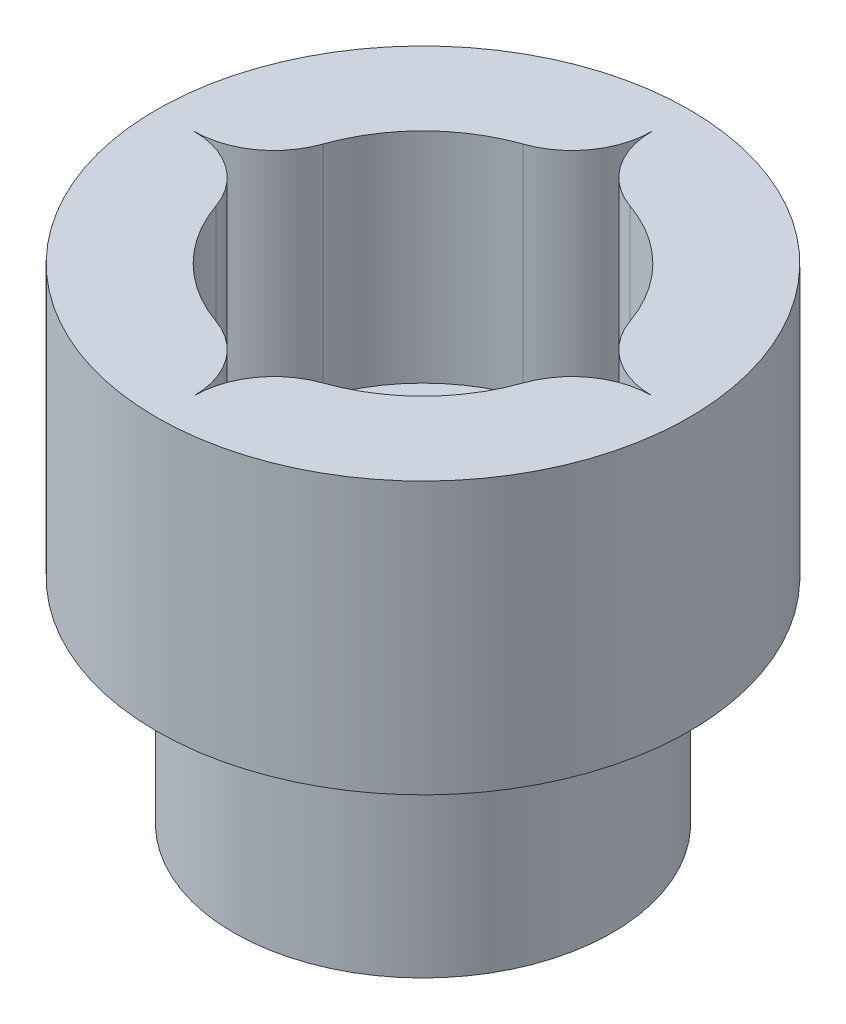
ISO-10303-21;
HEADER;
FILE_DESCRIPTION(('STEP AP214'),'2;1');
FILE_NAME('part.step','',(''),(''),'','','');
FILE_SCHEMA(('AUTOMOTIVE_DESIGN { 1 0 10303 214 1 1 1 1 }'));
ENDSEC;
DATA;
#1=APPLICATION_CONTEXT('core data for automotive mechanical design processes');
#2=APPLICATION_PROTOCOL_DEFINITION('international standard','automotive_design',2000,#1);
#3=PRODUCT_CONTEXT('',#1,'mechanical');
#4=PRODUCT('Part','Part','',(#3));
#5=PRODUCT_RELATED_PRODUCT_CATEGORY('part','',(#4));
#6=PRODUCT_DEFINITION_FORMATION('','',#4);
#7=PRODUCT_DEFINITION_CONTEXT('part definition',#1,'design');
#8=PRODUCT_DEFINITION('design','',#6,#7);
#9=PRODUCT_DEFINITION_SHAPE('','',#8);
#10=(LENGTH_UNIT() NAMED_UNIT(*) SI_UNIT(.MILLI.,.METRE.));
#11=(NAMED_UNIT(*) PLANE_ANGLE_UNIT() SI_UNIT($,.RADIAN.));
#12=(NAMED_UNIT(*) SI_UNIT($,.STERADIAN.) SOLID_ANGLE_UNIT());
#13=UNCERTAINTY_MEASURE_WITH_UNIT(LENGTH_MEASURE(1.E-05),#10,'distance_accuracy_value','');
#14=(GEOMETRIC_REPRESENTATION_CONTEXT(3) GLOBAL_UNCERTAINTY_ASSIGNED_CONTEXT((#13)) GLOBAL_UNIT_ASSIGNED_CONTEXT((#10,
#11,#12)) REPRESENTATION_CONTEXT('',''));
#15=CARTESIAN_POINT('',(0.,0.,0.));
#16=DIRECTION('',(0.,0.,1.));
#17=DIRECTION('',(1.,0.,0.));
#18=AXIS2_PLACEMENT_3D('',#15,#16,#17);
#19=CARTESIAN_POINT('',(0.,4.,0.));
#20=DIRECTION('',(0.,-1.,0.));
#21=DIRECTION('',(0.,0.,-1.));
#22=AXIS2_PLACEMENT_3D('',#19,#20,#21);
#23=CYLINDRICAL_SURFACE('',#22,1.65);
#24=CARTESIAN_POINT('',(0.,0.,0.));
#25=DIRECTION('',(0.,1.,0.));
#26=DIRECTION('',(0.,0.,1.));
#27=AXIS2_PLACEMENT_3D('',#24,#25,#26);
#28=CIRCLE('',#27,1.65);
#29=CARTESIAN_POINT('',(0.824999999999999,0.,1.42894191624432));
#30=VERTEX_POINT('',#29);
#31=CARTESIAN_POINT('',(1.46542854883102,0.,0.758300183483433));
#32=VERTEX_POINT('',#31);
#33=EDGE_CURVE('E398',#30,#32,#28,.T.);
#34=ORIENTED_EDGE('',*,*,#33,.F.);
#35=DIRECTION('',(0.,-1.,0.));
#36=VECTOR('',#35,1.);
#37=CARTESIAN_POINT('',(0.824999999999999,4.,1.42894191624432));
#38=LINE('',#37,#36);
#39=CARTESIAN_POINT('',(0.824999999999999,4.,1.42894191624432));
#40=VERTEX_POINT('',#39);
#41=EDGE_CURVE('E11',#40,#30,#38,.T.);
#42=ORIENTED_EDGE('',*,*,#41,.F.);
#43=CARTESIAN_POINT('',(0.,4.,0.));
#44=DIRECTION('',(0.,1.,0.));
#45=DIRECTION('',(0.,0.,1.));
#46=AXIS2_PLACEMENT_3D('',#43,#44,#45);
#47=CIRCLE('',#46,1.65);
#48=CARTESIAN_POINT('',(1.46542854883102,4.,0.758300183483433));
#49=VERTEX_POINT('',#48);
#50=EDGE_CURVE('E349',#40,#49,#47,.T.);
#51=ORIENTED_EDGE('',*,*,#50,.T.);
#52=DIRECTION('',(0.,-1.,0.));
#53=VECTOR('',#52,1.);
#54=CARTESIAN_POINT('',(1.46542854883102,4.,0.758300183483433));
#55=LINE('',#54,#53);
#56=EDGE_CURVE('E394',#49,#32,#55,.T.);
#57=ORIENTED_EDGE('',*,*,#56,.T.);
#58=EDGE_LOOP('',(#34,#42,#51,#57));
#59=FACE_BOUND('',#58,.T.);
#60=ADVANCED_FACE('F47',(#59),#23,.F.);
#61=CARTESIAN_POINT('',(1.6175,4.,2.80159218124266));
#62=DIRECTION('',(0.,-1.,0.));
#63=DIRECTION('',(0.,0.,-1.));
#64=AXIS2_PLACEMENT_3D('',#61,#62,#63);
#65=CYLINDRICAL_SURFACE('',#64,1.585);
#66=CARTESIAN_POINT('',(1.6175,0.,2.80159218124266));
#67=DIRECTION('',(0.,1.,0.));
#68=DIRECTION('',(0.,0.,1.));
#69=AXIS2_PLACEMENT_3D('',#66,#67,#68);
#70=CIRCLE('',#69,1.585);
#71=CARTESIAN_POINT('',(0.0325,0.,2.80159218124266));
#72=VERTEX_POINT('',#71);
#73=EDGE_CURVE('E402',#72,#30,#70,.F.);
#74=ORIENTED_EDGE('',*,*,#73,.F.);
#75=DIRECTION('',(0.,-1.,0.));
#76=VECTOR('',#75,1.);
#77=CARTESIAN_POINT('',(0.0325,4.,2.80159218124266));
#78=LINE('',#77,#76);
#79=CARTESIAN_POINT('',(0.0325,4.,2.80159218124266));
#80=VERTEX_POINT('',#79);
#81=EDGE_CURVE('E56',#80,#72,#78,.T.);
#82=ORIENTED_EDGE('',*,*,#81,.F.);
#83=CARTESIAN_POINT('',(1.6175,4.,2.80159218124266));
#84=DIRECTION('',(0.,1.,0.));
#85=DIRECTION('',(0.,0.,1.));
#86=AXIS2_PLACEMENT_3D('',#83,#84,#85);
#87=CIRCLE('',#86,1.585);
#88=EDGE_CURVE('E354',#80,#40,#87,.F.);
#89=ORIENTED_EDGE('',*,*,#88,.T.);
#90=ORIENTED_EDGE('',*,*,#41,.T.);
#91=EDGE_LOOP('',(#74,#82,#89,#90));
#92=FACE_BOUND('',#91,.T.);
#93=ADVANCED_FACE('F486',(#92),#65,.T.);
#94=CARTESIAN_POINT('',(-1.55209706631351,4.,2.83732924086716));
#95=DIRECTION('',(0.,-1.,0.));
#96=DIRECTION('',(0.,0.,-1.));
#97=AXIS2_PLACEMENT_3D('',#94,#95,#96);
#98=CYLINDRICAL_SURFACE('',#97,1.585);
#99=CARTESIAN_POINT('',(-1.55209706631351,0.,2.83732924086716));
#100=DIRECTION('',(0.,1.,0.));
#101=DIRECTION('',(0.,0.,1.));
#102=AXIS2_PLACEMENT_3D('',#99,#100,#101);
#103=CIRCLE('',#102,1.585);
#104=CARTESIAN_POINT('',(-0.825000000000001,0.,1.42894191624432));
#105=VERTEX_POINT('',#104);
#106=EDGE_CURVE('E406',#72,#105,#103,.T.);
#107=ORIENTED_EDGE('',*,*,#106,.T.);
#108=DIRECTION('',(0.,-1.,0.));
#109=VECTOR('',#108,1.);
#110=CARTESIAN_POINT('',(-0.825000000000001,4.,1.42894191624432));
#111=LINE('',#110,#109);
#112=CARTESIAN_POINT('',(-0.825000000000001,4.,1.42894191624432));
#113=VERTEX_POINT('',#112);
#114=EDGE_CURVE('E471',#113,#105,#111,.T.);
#115=ORIENTED_EDGE('',*,*,#114,.F.);
#116=CARTESIAN_POINT('',(-1.55209706631351,4.,2.83732924086716));
#117=DIRECTION('',(0.,1.,0.));
#118=DIRECTION('',(0.,0.,1.));
#119=AXIS2_PLACEMENT_3D('',#116,#117,#118);
#120=CIRCLE('',#119,1.585);
#121=EDGE_CURVE('E358',#80,#113,#120,.T.);
#122=ORIENTED_EDGE('',*,*,#121,.F.);
#123=ORIENTED_EDGE('',*,*,#81,.T.);
#124=EDGE_LOOP('',(#107,#115,#122,#123));
#125=FACE_BOUND('',#124,.T.);
#126=ADVANCED_FACE('F478',(#125),#98,.T.);
#127=CARTESIAN_POINT('',(0.,4.,0.));
#128=DIRECTION('',(0.,-1.,0.));
#129=DIRECTION('',(0.,0.,-1.));
#130=AXIS2_PLACEMENT_3D('',#127,#128,#129);
#131=CYLINDRICAL_SURFACE('',#130,1.65);
#132=CARTESIAN_POINT('',(0.,0.,0.));
#133=DIRECTION('',(0.,1.,0.));
#134=DIRECTION('',(0.,0.,1.));
#135=AXIS2_PLACEMENT_3D('',#132,#133,#134);
#136=CIRCLE('',#135,1.65);
#137=CARTESIAN_POINT('',(-1.42894191624432,0.,0.825));
#138=VERTEX_POINT('',#137);
#139=EDGE_CURVE('E410',#138,#105,#136,.T.);
#140=ORIENTED_EDGE('',*,*,#139,.F.);
#141=DIRECTION('',(0.,-1.,0.));
#142=VECTOR('',#141,1.);
#143=CARTESIAN_POINT('',(-1.42894191624432,4.,0.825));
#144=LINE('',#143,#142);
#145=CARTESIAN_POINT('',(-1.42894191624432,4.,0.825));
#146=VERTEX_POINT('',#145);
#147=EDGE_CURVE('E468',#146,#138,#144,.T.);
#148=ORIENTED_EDGE('',*,*,#147,.F.);
#149=CARTESIAN_POINT('',(0.,4.,0.));
#150=DIRECTION('',(0.,1.,0.));
#151=DIRECTION('',(0.,0.,1.));
#152=AXIS2_PLACEMENT_3D('',#149,#150,#151);
#153=CIRCLE('',#152,1.65);
#154=EDGE_CURVE('E361',#146,#113,#153,.T.);
#155=ORIENTED_EDGE('',*,*,#154,.T.);
#156=ORIENTED_EDGE('',*,*,#114,.T.);
#157=EDGE_LOOP('',(#140,#148,#155,#156));
#158=FACE_BOUND('',#157,.T.);
#159=ADVANCED_FACE('F526',(#158),#131,.F.);
#160=CARTESIAN_POINT('',(-2.83732924086716,4.,1.55209706631351));
#161=DIRECTION('',(0.,-1.,0.));
#162=DIRECTION('',(0.,0.,-1.));
#163=AXIS2_PLACEMENT_3D('',#160,#161,#162);
#164=CYLINDRICAL_SURFACE('',#163,1.585);
#165=CARTESIAN_POINT('',(-2.83732924086716,0.,1.55209706631351));
#166=DIRECTION('',(0.,1.,0.));
#167=DIRECTION('',(0.,0.,1.));
#168=AXIS2_PLACEMENT_3D('',#165,#166,#167);
#169=CIRCLE('',#168,1.585);
#170=CARTESIAN_POINT('',(-2.80159218124266,0.,-0.0325000000000002));
#171=VERTEX_POINT('',#170);
#172=EDGE_CURVE('E414',#138,#171,#169,.T.);
#173=ORIENTED_EDGE('',*,*,#172,.T.);
#174=DIRECTION('',(0.,-1.,0.));
#175=VECTOR('',#174,1.);
#176=CARTESIAN_POINT('',(-2.80159218124266,4.,-0.0325000000000002));
#177=LINE('',#176,#175);
#178=CARTESIAN_POINT('',(-2.80159218124266,4.,-0.0325000000000002));
#179=VERTEX_POINT('',#178);
#180=EDGE_CURVE('E465',#179,#171,#177,.T.);
#181=ORIENTED_EDGE('',*,*,#180,.F.);
#182=CARTESIAN_POINT('',(-2.83732924086716,4.,1.55209706631351));
#183=DIRECTION('',(0.,1.,0.));
#184=DIRECTION('',(0.,0.,1.));
#185=AXIS2_PLACEMENT_3D('',#182,#183,#184);
#186=CIRCLE('',#185,1.585);
#187=EDGE_CURVE('E365',#146,#179,#186,.T.);
#188=ORIENTED_EDGE('',*,*,#187,.F.);
#189=ORIENTED_EDGE('',*,*,#147,.T.);
#190=EDGE_LOOP('',(#173,#181,#188,#189));
#191=FACE_BOUND('',#190,.T.);
#192=ADVANCED_FACE('F523',(#191),#164,.T.);
#193=CARTESIAN_POINT('',(-2.80159218124266,4.,-1.6175));
#194=DIRECTION('',(0.,-1.,0.));
#195=DIRECTION('',(0.,0.,-1.));
#196=AXIS2_PLACEMENT_3D('',#193,#194,#195);
#197=CYLINDRICAL_SURFACE('',#196,1.585);
#198=CARTESIAN_POINT('',(-2.80159218124266,0.,-1.6175));
#199=DIRECTION('',(0.,1.,0.));
#200=DIRECTION('',(0.,0.,1.));
#201=AXIS2_PLACEMENT_3D('',#198,#199,#200);
#202=CIRCLE('',#201,1.585);
#203=CARTESIAN_POINT('',(-1.42894191624432,0.,-0.825));
#204=VERTEX_POINT('',#203);
#205=EDGE_CURVE('E418',#204,#171,#202,.F.);
#206=ORIENTED_EDGE('',*,*,#205,.F.);
#207=DIRECTION('',(0.,-1.,0.));
#208=VECTOR('',#207,1.);
#209=CARTESIAN_POINT('',(-1.42894191624432,4.,-0.825));
#210=LINE('',#209,#208);
#211=CARTESIAN_POINT('',(-1.42894191624432,4.,-0.825));
#212=VERTEX_POINT('',#211);
#213=EDGE_CURVE('E462',#212,#204,#210,.T.);
#214=ORIENTED_EDGE('',*,*,#213,.F.);
#215=CARTESIAN_POINT('',(-2.80159218124266,4.,-1.6175));
#216=DIRECTION('',(0.,1.,0.));
#217=DIRECTION('',(0.,0.,1.));
#218=AXIS2_PLACEMENT_3D('',#215,#216,#217);
#219=CIRCLE('',#218,1.585);
#220=EDGE_CURVE('E368',#212,#179,#219,.F.);
#221=ORIENTED_EDGE('',*,*,#220,.T.);
#222=ORIENTED_EDGE('',*,*,#180,.T.);
#223=EDGE_LOOP('',(#206,#214,#221,#222));
#224=FACE_BOUND('',#223,.T.);
#225=ADVANCED_FACE('F519',(#224),#197,.T.);
#226=CARTESIAN_POINT('',(0.,4.,0.));
#227=DIRECTION('',(0.,-1.,0.));
#228=DIRECTION('',(0.,0.,-1.));
#229=AXIS2_PLACEMENT_3D('',#226,#227,#228);
#230=CYLINDRICAL_SURFACE('',#229,1.65);
#231=CARTESIAN_POINT('',(0.,0.,0.));
#232=DIRECTION('',(0.,1.,0.));
#233=DIRECTION('',(0.,0.,1.));
#234=AXIS2_PLACEMENT_3D('',#231,#232,#233);
#235=CIRCLE('',#234,1.65);
#236=CARTESIAN_POINT('',(-0.808423493044823,0.,-1.43838501657004));
#237=VERTEX_POINT('',#236);
#238=EDGE_CURVE('E422',#237,#204,#235,.T.);
#239=ORIENTED_EDGE('',*,*,#238,.F.);
#240=DIRECTION('',(0.,-1.,0.));
#241=VECTOR('',#240,1.);
#242=CARTESIAN_POINT('',(-0.808423493044823,4.,-1.43838501657004));
#243=LINE('',#242,#241);
#244=CARTESIAN_POINT('',(-0.808423493044823,4.,-1.43838501657004));
#245=VERTEX_POINT('',#244);
#246=EDGE_CURVE('E459',#245,#237,#243,.T.);
#247=ORIENTED_EDGE('',*,*,#246,.F.);
#248=CARTESIAN_POINT('',(0.,4.,0.));
#249=DIRECTION('',(0.,1.,0.));
#250=DIRECTION('',(0.,0.,1.));
#251=AXIS2_PLACEMENT_3D('',#248,#249,#250);
#252=CIRCLE('',#251,1.65);
#253=EDGE_CURVE('E372',#245,#212,#252,.T.);
#254=ORIENTED_EDGE('',*,*,#253,.T.);
#255=ORIENTED_EDGE('',*,*,#213,.T.);
#256=EDGE_LOOP('',(#239,#247,#254,#255));
#257=FACE_BOUND('',#256,.T.);
#258=ADVANCED_FACE('F515',(#257),#230,.F.);
#259=CARTESIAN_POINT('',(-1.585,4.,-2.82010638097218));
#260=DIRECTION('',(0.,-1.,0.));
#261=DIRECTION('',(0.,0.,-1.));
#262=AXIS2_PLACEMENT_3D('',#259,#260,#261);
#263=CYLINDRICAL_SURFACE('',#262,1.585);
#264=CARTESIAN_POINT('',(-1.585,0.,-2.82010638097218));
#265=DIRECTION('',(0.,1.,0.));
#266=DIRECTION('',(0.,0.,1.));
#267=AXIS2_PLACEMENT_3D('',#264,#265,#266);
#268=CIRCLE('',#267,1.585);
#269=CARTESIAN_POINT('',(0.,0.,-2.82010638097218));
#270=VERTEX_POINT('',#269);
#271=EDGE_CURVE('E426',#270,#237,#268,.F.);
#272=ORIENTED_EDGE('',*,*,#271,.F.);
#273=DIRECTION('',(0.,-1.,0.));
#274=VECTOR('',#273,1.);
#275=CARTESIAN_POINT('',(0.,4.,-2.82010638097218));
#276=LINE('',#275,#274);
#277=CARTESIAN_POINT('',(0.,4.,-2.82010638097218));
#278=VERTEX_POINT('',#277);
#279=EDGE_CURVE('E456',#278,#270,#276,.T.);
#280=ORIENTED_EDGE('',*,*,#279,.F.);
#281=CARTESIAN_POINT('',(-1.585,4.,-2.82010638097218));
#282=DIRECTION('',(0.,1.,0.));
#283=DIRECTION('',(0.,0.,1.));
#284=AXIS2_PLACEMENT_3D('',#281,#282,#283);
#285=CIRCLE('',#284,1.585);
#286=EDGE_CURVE('E376',#278,#245,#285,.F.);
#287=ORIENTED_EDGE('',*,*,#286,.T.);
#288=ORIENTED_EDGE('',*,*,#246,.T.);
#289=EDGE_LOOP('',(#272,#280,#287,#288));
#290=FACE_BOUND('',#289,.T.);
#291=ADVANCED_FACE('F511',(#290),#263,.T.);
#292=CARTESIAN_POINT('',(1.585,4.,-2.82010638097218));
#293=DIRECTION('',(0.,-1.,0.));
#294=DIRECTION('',(0.,0.,-1.));
#295=AXIS2_PLACEMENT_3D('',#292,#293,#294);
#296=CYLINDRICAL_SURFACE('',#295,1.585);
#297=CARTESIAN_POINT('',(1.585,0.,-2.82010638097218));
#298=DIRECTION('',(0.,1.,0.));
#299=DIRECTION('',(0.,0.,1.));
#300=AXIS2_PLACEMENT_3D('',#297,#298,#299);
#301=CIRCLE('',#300,1.585);
#302=CARTESIAN_POINT('',(0.808423493044822,0.,-1.43838501657005));
#303=VERTEX_POINT('',#302);
#304=EDGE_CURVE('E430',#270,#303,#301,.T.);
#305=ORIENTED_EDGE('',*,*,#304,.T.);
#306=DIRECTION('',(0.,-1.,0.));
#307=VECTOR('',#306,1.);
#308=CARTESIAN_POINT('',(0.808423493044822,4.,-1.43838501657005));
#309=LINE('',#308,#307);
#310=CARTESIAN_POINT('',(0.808423493044822,4.,-1.43838501657005));
#311=VERTEX_POINT('',#310);
#312=EDGE_CURVE('E453',#311,#303,#309,.T.);
#313=ORIENTED_EDGE('',*,*,#312,.F.);
#314=CARTESIAN_POINT('',(1.585,4.,-2.82010638097218));
#315=DIRECTION('',(0.,1.,0.));
#316=DIRECTION('',(0.,0.,1.));
#317=AXIS2_PLACEMENT_3D('',#314,#315,#316);
#318=CIRCLE('',#317,1.585);
#319=EDGE_CURVE('E380',#278,#311,#318,.T.);
#320=ORIENTED_EDGE('',*,*,#319,.F.);
#321=ORIENTED_EDGE('',*,*,#279,.T.);
#322=EDGE_LOOP('',(#305,#313,#320,#321));
#323=FACE_BOUND('',#322,.T.);
#324=ADVANCED_FACE('F507',(#323),#296,.T.);
#325=CARTESIAN_POINT('',(0.,4.,0.));
#326=DIRECTION('',(0.,-1.,0.));
#327=DIRECTION('',(0.,0.,-1.));
#328=AXIS2_PLACEMENT_3D('',#325,#326,#327);
#329=CYLINDRICAL_SURFACE('',#328,1.65);
#330=CARTESIAN_POINT('',(0.,0.,0.));
#331=DIRECTION('',(0.,1.,0.));
#332=DIRECTION('',(0.,0.,1.));
#333=AXIS2_PLACEMENT_3D('',#330,#331,#332);
#334=CIRCLE('',#333,1.65);
#335=CARTESIAN_POINT('',(1.42894191624432,0.,-0.825));
#336=VERTEX_POINT('',#335);
#337=EDGE_CURVE('E434',#336,#303,#334,.T.);
#338=ORIENTED_EDGE('',*,*,#337,.F.);
#339=DIRECTION('',(0.,-1.,0.));
#340=VECTOR('',#339,1.);
#341=CARTESIAN_POINT('',(1.42894191624432,4.,-0.825));
#342=LINE('',#341,#340);
#343=CARTESIAN_POINT('',(1.42894191624432,4.,-0.825));
#344=VERTEX_POINT('',#343);
#345=EDGE_CURVE('E450',#344,#336,#342,.T.);
#346=ORIENTED_EDGE('',*,*,#345,.F.);
#347=CARTESIAN_POINT('',(0.,4.,0.));
#348=DIRECTION('',(0.,1.,0.));
#349=DIRECTION('',(0.,0.,1.));
#350=AXIS2_PLACEMENT_3D('',#347,#348,#349);
#351=CIRCLE('',#350,1.65);
#352=EDGE_CURVE('E383',#344,#311,#351,.T.);
#353=ORIENTED_EDGE('',*,*,#352,.T.);
#354=ORIENTED_EDGE('',*,*,#312,.T.);
#355=EDGE_LOOP('',(#338,#346,#353,#354));
#356=FACE_BOUND('',#355,.T.);
#357=ADVANCED_FACE('F503',(#356),#329,.F.);
#358=CARTESIAN_POINT('',(2.80159218124266,4.,-1.6175));
#359=DIRECTION('',(0.,-1.,0.));
#360=DIRECTION('',(0.,0.,-1.));
#361=AXIS2_PLACEMENT_3D('',#358,#359,#360);
#362=CYLINDRICAL_SURFACE('',#361,1.585);
#363=CARTESIAN_POINT('',(2.80159218124266,0.,-1.6175));
#364=DIRECTION('',(0.,1.,0.));
#365=DIRECTION('',(0.,0.,1.));
#366=AXIS2_PLACEMENT_3D('',#363,#364,#365);
#367=CIRCLE('',#366,1.585);
#368=CARTESIAN_POINT('',(2.80159218124266,0.,-0.0325000000000002));
#369=VERTEX_POINT('',#368);
#370=EDGE_CURVE('E438',#336,#369,#367,.T.);
#371=ORIENTED_EDGE('',*,*,#370,.T.);
#372=DIRECTION('',(0.,-1.,0.));
#373=VECTOR('',#372,1.);
#374=CARTESIAN_POINT('',(2.80159218124266,4.,-0.0325000000000002));
#375=LINE('',#374,#373);
#376=CARTESIAN_POINT('',(2.80159218124266,4.,-0.0325000000000002));
#377=VERTEX_POINT('',#376);
#378=EDGE_CURVE('E447',#377,#369,#375,.T.);
#379=ORIENTED_EDGE('',*,*,#378,.F.);
#380=CARTESIAN_POINT('',(2.80159218124266,4.,-1.6175));
#381=DIRECTION('',(0.,1.,0.));
#382=DIRECTION('',(0.,0.,1.));
#383=AXIS2_PLACEMENT_3D('',#380,#381,#382);
#384=CIRCLE('',#383,1.585);
#385=EDGE_CURVE('E387',#344,#377,#384,.T.);
#386=ORIENTED_EDGE('',*,*,#385,.F.);
#387=ORIENTED_EDGE('',*,*,#345,.T.);
#388=EDGE_LOOP('',(#371,#379,#386,#387));
#389=FACE_BOUND('',#388,.T.);
#390=ADVANCED_FACE('F498',(#389),#362,.T.);
#391=CARTESIAN_POINT('',(0.,4.,0.));
#392=DIRECTION('',(0.,-1.,0.));
#393=DIRECTION('',(0.,0.,-1.));
#394=AXIS2_PLACEMENT_3D('',#391,#392,#393);
#395=CYLINDRICAL_SURFACE('',#394,3.55107458235115);
#396=CARTESIAN_POINT('',(0.,4.,0.));
#397=DIRECTION('',(0.,1.,0.));
#398=DIRECTION('',(0.,0.,1.));
#399=AXIS2_PLACEMENT_3D('',#396,#397,#398);
#400=CIRCLE('',#399,3.55107458235115);
#401=CARTESIAN_POINT('',(0.,4.,3.55107458235115));
#402=VERTEX_POINT('',#401);
#403=EDGE_CURVE('E345',#402,#402,#400,.T.);
#404=ORIENTED_EDGE('',*,*,#403,.F.);
#405=EDGE_LOOP('',(#404));
#406=FACE_BOUND('',#405,.T.);
#407=CARTESIAN_POINT('',(0.,0.,0.));
#408=DIRECTION('',(0.,1.,0.));
#409=DIRECTION('',(0.,0.,1.));
#410=AXIS2_PLACEMENT_3D('',#407,#408,#409);
#411=CIRCLE('',#410,3.55107458235115);
#412=CARTESIAN_POINT('',(0.,0.,3.55107458235115));
#413=VERTEX_POINT('',#412);
#414=EDGE_CURVE('E344',#413,#413,#411,.T.);
#415=ORIENTED_EDGE('',*,*,#414,.T.);
#416=EDGE_LOOP('',(#415));
#417=FACE_BOUND('',#416,.T.);
#418=ADVANCED_FACE('F49',(#406,#417),#395,.T.);
#419=CARTESIAN_POINT('',(2.83732924086716,4.,1.55209706631351));
#420=DIRECTION('',(0.,-1.,0.));
#421=DIRECTION('',(0.,0.,-1.));
#422=AXIS2_PLACEMENT_3D('',#419,#420,#421);
#423=CYLINDRICAL_SURFACE('',#422,1.585);
#424=CARTESIAN_POINT('',(2.83732924086716,0.,1.55209706631351));
#425=DIRECTION('',(0.,1.,0.));
#426=DIRECTION('',(0.,0.,1.));
#427=AXIS2_PLACEMENT_3D('',#424,#425,#426);
#428=CIRCLE('',#427,1.585);
#429=EDGE_CURVE('E350',#32,#369,#428,.F.);
#430=ORIENTED_EDGE('',*,*,#429,.F.);
#431=ORIENTED_EDGE('',*,*,#56,.F.);
#432=CARTESIAN_POINT('',(2.83732924086716,4.,1.55209706631351));
#433=DIRECTION('',(0.,1.,0.));
#434=DIRECTION('',(0.,0.,1.));
#435=AXIS2_PLACEMENT_3D('',#432,#433,#434);
#436=CIRCLE('',#435,1.585);
#437=EDGE_CURVE('E390',#49,#377,#436,.F.);
#438=ORIENTED_EDGE('',*,*,#437,.T.);
#439=ORIENTED_EDGE('',*,*,#378,.T.);
#440=EDGE_LOOP('',(#430,#431,#438,#439));
#441=FACE_BOUND('',#440,.T.);
#442=ADVANCED_FACE('F494',(#441),#423,.T.);
#443=CARTESIAN_POINT('',(0.,0.,0.));
#444=DIRECTION('',(0.,1.,0.));
#445=DIRECTION('',(0.,0.,1.));
#446=AXIS2_PLACEMENT_3D('',#443,#444,#445);
#447=PLANE('',#446);
#448=ORIENTED_EDGE('',*,*,#414,.F.);
#449=EDGE_LOOP('',(#448));
#450=FACE_BOUND('',#449,.T.);
#451=ORIENTED_EDGE('',*,*,#33,.T.);
#452=ORIENTED_EDGE('',*,*,#429,.T.);
#453=ORIENTED_EDGE('',*,*,#370,.F.);
#454=ORIENTED_EDGE('',*,*,#337,.T.);
#455=ORIENTED_EDGE('',*,*,#304,.F.);
#456=ORIENTED_EDGE('',*,*,#271,.T.);
#457=ORIENTED_EDGE('',*,*,#238,.T.);
#458=ORIENTED_EDGE('',*,*,#205,.T.);
#459=ORIENTED_EDGE('',*,*,#172,.F.);
#460=ORIENTED_EDGE('',*,*,#139,.T.);
#461=ORIENTED_EDGE('',*,*,#106,.F.);
#462=ORIENTED_EDGE('',*,*,#73,.T.);
#463=EDGE_LOOP('',(#451,#452,#453,#454,#455,#456,#457,#458,#459,#460,#461,#462));
#464=FACE_BOUND('',#463,.T.);
#465=ADVANCED_FACE('F483',(#450,#464),#447,.F.);
#466=CARTESIAN_POINT('',(0.,4.,0.));
#467=DIRECTION('',(0.,1.,0.));
#468=DIRECTION('',(0.,0.,1.));
#469=AXIS2_PLACEMENT_3D('',#466,#467,#468);
#470=PLANE('',#469);
#471=ORIENTED_EDGE('',*,*,#50,.F.);
#472=ORIENTED_EDGE('',*,*,#88,.F.);
#473=ORIENTED_EDGE('',*,*,#121,.T.);
#474=ORIENTED_EDGE('',*,*,#154,.F.);
#475=ORIENTED_EDGE('',*,*,#187,.T.);
#476=ORIENTED_EDGE('',*,*,#220,.F.);
#477=ORIENTED_EDGE('',*,*,#253,.F.);
#478=ORIENTED_EDGE('',*,*,#286,.F.);
#479=ORIENTED_EDGE('',*,*,#319,.T.);
#480=ORIENTED_EDGE('',*,*,#352,.F.);
#481=ORIENTED_EDGE('',*,*,#385,.T.);
#482=ORIENTED_EDGE('',*,*,#437,.F.);
#483=EDGE_LOOP('',(#471,#472,#473,#474,#475,#476,#477,#478,#479,#480,#481,#482));
#484=FACE_BOUND('',#483,.T.);
#485=ADVANCED_FACE('F528',(#484),#470,.F.);
#486=CARTESIAN_POINT('',(0.,4.,0.));
#487=DIRECTION('',(0.,1.,0.));
#488=DIRECTION('',(0.,0.,1.));
#489=AXIS2_PLACEMENT_3D('',#486,#487,#488);
#490=CIRCLE('',#489,5.);
#491=CARTESIAN_POINT('',(0.,4.,5.));
#492=VERTEX_POINT('',#491);
#493=EDGE_CURVE('E340',#492,#492,#490,.T.);
#494=ORIENTED_EDGE('',*,*,#493,.F.);
#495=EDGE_LOOP('',(#494));
#496=FACE_BOUND('',#495,.T.);
#497=ORIENTED_EDGE('',*,*,#403,.T.);
#498=EDGE_LOOP('',(#497));
#499=FACE_BOUND('',#498,.T.);
#500=ADVANCED_FACE('F530',(#496,#499),#470,.F.);
#501=CARTESIAN_POINT('',(0.,5.,0.));
#502=DIRECTION('',(0.,-1.,0.));
#503=DIRECTION('',(0.,0.,-1.));
#504=AXIS2_PLACEMENT_3D('',#501,#502,#503);
#505=CYLINDRICAL_SURFACE('',#504,5.);
#506=ORIENTED_EDGE('',*,*,#493,.T.);
#507=EDGE_LOOP('',(#506));
#508=FACE_BOUND('',#507,.T.);
#509=CARTESIAN_POINT('',(0.,9.1,0.));
#510=DIRECTION('',(0.,1.,0.));
#511=DIRECTION('',(0.,0.,1.));
#512=AXIS2_PLACEMENT_3D('',#509,#510,#511);
#513=CIRCLE('',#512,5.);
#514=CARTESIAN_POINT('',(0.,9.1,5.));
#515=VERTEX_POINT('',#514);
#516=EDGE_CURVE('E224',#515,#515,#513,.T.);
#517=ORIENTED_EDGE('',*,*,#516,.F.);
#518=EDGE_LOOP('',(#517));
#519=FACE_BOUND('',#518,.T.);
#520=ADVANCED_FACE('F536',(#508,#519),#505,.T.);
#521=CARTESIAN_POINT('',(0.,9.1,0.));
#522=DIRECTION('',(0.,1.,0.));
#523=DIRECTION('',(0.,0.,1.));
#524=AXIS2_PLACEMENT_3D('',#521,#522,#523);
#525=PLANE('',#524);
#526=ORIENTED_EDGE('',*,*,#516,.T.);
#527=EDGE_LOOP('',(#526));
#528=FACE_BOUND('',#527,.T.);
#529=CARTESIAN_POINT('',(1.49621812217711,9.1,-4.29295126285873));
#530=DIRECTION('',(0.,-1.,0.));
#531=DIRECTION('',(0.,0.,1.));
#532=AXIS2_PLACEMENT_3D('',#529,#530,#531);
#533=CIRCLE('',#532,1.49621812217709);
#534=CARTESIAN_POINT('',(1.00379373580404,9.1,-2.8800864806392));
#535=VERTEX_POINT('',#534);
#536=CARTESIAN_POINT('',(0.,9.1,-4.29295126285873));
#537=VERTEX_POINT('',#536);
#538=EDGE_CURVE('E217',#535,#537,#533,.T.);
#539=ORIENTED_EDGE('',*,*,#538,.F.);
#540=CARTESIAN_POINT('',(0.,9.1,0.));
#541=DIRECTION('',(0.,1.,0.));
#542=DIRECTION('',(0.,0.,1.));
#543=AXIS2_PLACEMENT_3D('',#540,#541,#542);
#544=CIRCLE('',#543,3.05000000000009);
#545=CARTESIAN_POINT('',(2.8800864806393,9.1,-1.00379373580417));
#546=VERTEX_POINT('',#545);
#547=EDGE_CURVE('E207',#546,#535,#544,.T.);
#548=ORIENTED_EDGE('',*,*,#547,.F.);
#549=CARTESIAN_POINT('',(4.2929512628588,9.1,-1.49621812217727));
#550=DIRECTION('',(0.,-1.,0.));
#551=DIRECTION('',(0.,0.,-1.));
#552=AXIS2_PLACEMENT_3D('',#549,#550,#551);
#553=CIRCLE('',#552,1.49621812217707);
#554=CARTESIAN_POINT('',(4.2929512628588,9.1,-1.93638508005911E-13));
#555=VERTEX_POINT('',#554);
#556=EDGE_CURVE('E261',#555,#546,#553,.T.);
#557=ORIENTED_EDGE('',*,*,#556,.F.);
#558=CARTESIAN_POINT('',(4.2929512628588,9.1,1.49621812217681));
#559=DIRECTION('',(0.,-1.,0.));
#560=DIRECTION('',(0.,0.,1.));
#561=AXIS2_PLACEMENT_3D('',#558,#559,#560);
#562=CIRCLE('',#561,1.49621812217703);
#563=CARTESIAN_POINT('',(2.88008648063931,9.1,1.00379373580387));
#564=VERTEX_POINT('',#563);
#565=EDGE_CURVE('E257',#564,#555,#562,.T.);
#566=ORIENTED_EDGE('',*,*,#565,.F.);
#567=CARTESIAN_POINT('',(0.,9.1,0.));
#568=DIRECTION('',(0.,1.,0.));
#569=DIRECTION('',(0.,0.,1.));
#570=AXIS2_PLACEMENT_3D('',#567,#568,#569);
#571=CIRCLE('',#570,3.05000000000007);
#572=CARTESIAN_POINT('',(1.00379373580422,9.1,2.8800864806392));
#573=VERTEX_POINT('',#572);
#574=EDGE_CURVE('E254',#573,#564,#571,.T.);
#575=ORIENTED_EDGE('',*,*,#574,.F.);
#576=CARTESIAN_POINT('',(1.49621812217734,9.1,4.29295126285864));
#577=DIRECTION('',(0.,-1.,0.));
#578=DIRECTION('',(0.,0.,-1.));
#579=AXIS2_PLACEMENT_3D('',#576,#577,#578);
#580=CIRCLE('',#579,1.49621812217703);
#581=CARTESIAN_POINT('',(2.57823276617053E-13,9.1,4.29295126285861));
#582=VERTEX_POINT('',#581);
#583=EDGE_CURVE('E251',#582,#573,#580,.T.);
#584=ORIENTED_EDGE('',*,*,#583,.F.);
#585=CARTESIAN_POINT('',(-1.49621812217685,9.1,4.29295126285863));
#586=DIRECTION('',(0.,-1.,0.));
#587=DIRECTION('',(0.,0.,1.));
#588=AXIS2_PLACEMENT_3D('',#585,#586,#587);
#589=CIRCLE('',#588,1.4962181221771);
#590=CARTESIAN_POINT('',(-1.00379373580379,9.1,2.88008648063918));
#591=VERTEX_POINT('',#590);
#592=EDGE_CURVE('E248',#591,#582,#589,.T.);
#593=ORIENTED_EDGE('',*,*,#592,.F.);
#594=CARTESIAN_POINT('',(0.,9.1,0.));
#595=DIRECTION('',(0.,1.,0.));
#596=DIRECTION('',(0.,0.,1.));
#597=AXIS2_PLACEMENT_3D('',#594,#595,#596);
#598=CIRCLE('',#597,3.04999999999992);
#599=CARTESIAN_POINT('',(-2.8800864806391,9.1,1.0037937358041));
#600=VERTEX_POINT('',#599);
#601=EDGE_CURVE('E245',#600,#591,#598,.T.);
#602=ORIENTED_EDGE('',*,*,#601,.F.);
#603=CARTESIAN_POINT('',(-4.29295126285857,9.1,1.49621812217718));
#604=DIRECTION('',(0.,-1.,0.));
#605=DIRECTION('',(0.,0.,-1.));
#606=AXIS2_PLACEMENT_3D('',#603,#604,#605);
#607=CIRCLE('',#606,1.49621812217703);
#608=CARTESIAN_POINT('',(-4.29295126285851,9.1,1.06468653338077E-13));
#609=VERTEX_POINT('',#608);
#610=EDGE_CURVE('E242',#609,#600,#607,.T.);
#611=ORIENTED_EDGE('',*,*,#610,.F.);
#612=CARTESIAN_POINT('',(-4.29295126285855,9.1,-1.49621812217701));
#613=DIRECTION('',(0.,-1.,0.));
#614=DIRECTION('',(0.,0.,1.));
#615=AXIS2_PLACEMENT_3D('',#612,#613,#614);
#616=CIRCLE('',#615,1.49621812217711);
#617=CARTESIAN_POINT('',(-2.88008648063914,9.1,-1.00379373580396));
#618=VERTEX_POINT('',#617);
#619=EDGE_CURVE('E239',#618,#609,#616,.T.);
#620=ORIENTED_EDGE('',*,*,#619,.F.);
#621=CARTESIAN_POINT('',(0.,9.1,0.));
#622=DIRECTION('',(0.,1.,0.));
#623=DIRECTION('',(0.,0.,1.));
#624=AXIS2_PLACEMENT_3D('',#621,#622,#623);
#625=CIRCLE('',#624,3.04999999999993);
#626=CARTESIAN_POINT('',(-1.00379373580404,9.1,-2.8800864806392));
#627=VERTEX_POINT('',#626);
#628=EDGE_CURVE('E234',#627,#618,#625,.T.);
#629=ORIENTED_EDGE('',*,*,#628,.F.);
#630=CARTESIAN_POINT('',(-1.49621812217711,9.1,-4.29295126285873));
#631=DIRECTION('',(0.,-1.,0.));
#632=DIRECTION('',(0.,0.,-1.));
#633=AXIS2_PLACEMENT_3D('',#630,#631,#632);
#634=CIRCLE('',#633,1.49621812217709);
#635=EDGE_CURVE('E230',#537,#627,#634,.T.);
#636=ORIENTED_EDGE('',*,*,#635,.F.);
#637=EDGE_LOOP('',(#539,#548,#557,#566,#575,#584,#593,#602,#611,#620,#629,#636));
#638=FACE_BOUND('',#637,.T.);
#639=ADVANCED_FACE('F228',(#528,#638),#525,.T.);
#640=CARTESIAN_POINT('',(0.,9.1,0.));
#641=DIRECTION('',(0.,-1.,0.));
#642=DIRECTION('',(0.,0.,-1.));
#643=AXIS2_PLACEMENT_3D('',#640,#641,#642);
#644=CYLINDRICAL_SURFACE('',#643,3.05000000000009);
#645=CARTESIAN_POINT('',(0.,5.,0.));
#646=DIRECTION('',(0.,1.,0.));
#647=DIRECTION('',(0.,0.,1.));
#648=AXIS2_PLACEMENT_3D('',#645,#646,#647);
#649=CIRCLE('',#648,3.05000000000009);
#650=CARTESIAN_POINT('',(2.8800864806393,5.,-1.00379373580417));
#651=VERTEX_POINT('',#650);
#652=CARTESIAN_POINT('',(1.00379373580404,5.,-2.8800864806392));
#653=VERTEX_POINT('',#652);
#654=EDGE_CURVE('E63',#651,#653,#649,.T.);
#655=ORIENTED_EDGE('',*,*,#654,.F.);
#656=DIRECTION('',(0.,-1.,0.));
#657=VECTOR('',#656,1.);
#658=CARTESIAN_POINT('',(2.8800864806393,9.1,-1.00379373580417));
#659=LINE('',#658,#657);
#660=EDGE_CURVE('E212',#546,#651,#659,.T.);
#661=ORIENTED_EDGE('',*,*,#660,.F.);
#662=ORIENTED_EDGE('',*,*,#547,.T.);
#663=DIRECTION('',(0.,-1.,0.));
#664=VECTOR('',#663,1.);
#665=CARTESIAN_POINT('',(1.00379373580404,9.1,-2.8800864806392));
#666=LINE('',#665,#664);
#667=EDGE_CURVE('E210',#535,#653,#666,.T.);
#668=ORIENTED_EDGE('',*,*,#667,.T.);
#669=EDGE_LOOP('',(#655,#661,#662,#668));
#670=FACE_BOUND('',#669,.T.);
#671=ADVANCED_FACE('F209',(#670),#644,.F.);
#672=CARTESIAN_POINT('',(1.49621812217711,9.1,-4.29295126285873));
#673=DIRECTION('',(0.,-1.,0.));
#674=DIRECTION('',(0.,0.,-1.));
#675=AXIS2_PLACEMENT_3D('',#672,#673,#674);
#676=CYLINDRICAL_SURFACE('',#675,1.49621812217709);
#677=CARTESIAN_POINT('',(1.49621812217711,5.,-4.29295126285873));
#678=DIRECTION('',(0.,-1.,0.));
#679=DIRECTION('',(0.,0.,1.));
#680=AXIS2_PLACEMENT_3D('',#677,#678,#679);
#681=CIRCLE('',#680,1.49621812217709);
#682=CARTESIAN_POINT('',(0.,5.,-4.29295126285873));
#683=VERTEX_POINT('',#682);
#684=EDGE_CURVE('E67',#653,#683,#681,.T.);
#685=ORIENTED_EDGE('',*,*,#684,.F.);
#686=ORIENTED_EDGE('',*,*,#667,.F.);
#687=ORIENTED_EDGE('',*,*,#538,.T.);
#688=DIRECTION('',(0.,-1.,0.));
#689=VECTOR('',#688,1.);
#690=CARTESIAN_POINT('',(0.,9.1,-4.29295126285873));
#691=LINE('',#690,#689);
#692=EDGE_CURVE('E225',#537,#683,#691,.T.);
#693=ORIENTED_EDGE('',*,*,#692,.T.);
#694=EDGE_LOOP('',(#685,#686,#687,#693));
#695=FACE_BOUND('',#694,.T.);
#696=ADVANCED_FACE('F221',(#695),#676,.T.);
#697=CARTESIAN_POINT('',(-1.49621812217711,9.1,-4.29295126285873));
#698=DIRECTION('',(0.,-1.,0.));
#699=DIRECTION('',(0.,0.,-1.));
#700=AXIS2_PLACEMENT_3D('',#697,#698,#699);
#701=CYLINDRICAL_SURFACE('',#700,1.49621812217709);
#702=CARTESIAN_POINT('',(-1.49621812217711,5.,-4.29295126285873));
#703=DIRECTION('',(0.,-1.,0.));
#704=DIRECTION('',(0.,0.,-1.));
#705=AXIS2_PLACEMENT_3D('',#702,#703,#704);
#706=CIRCLE('',#705,1.49621812217709);
#707=CARTESIAN_POINT('',(-1.00379373580402,5.,-2.88008648063912));
#708=VERTEX_POINT('',#707);
#709=EDGE_CURVE('E268',#683,#708,#706,.T.);
#710=ORIENTED_EDGE('',*,*,#709,.F.);
#711=ORIENTED_EDGE('',*,*,#692,.F.);
#712=ORIENTED_EDGE('',*,*,#635,.T.);
#713=DIRECTION('',(0.,-1.,0.));
#714=VECTOR('',#713,1.);
#715=CARTESIAN_POINT('',(-1.00379373580404,9.1,-2.8800864806392));
#716=LINE('',#715,#714);
#717=EDGE_CURVE('E331',#627,#708,#716,.T.);
#718=ORIENTED_EDGE('',*,*,#717,.T.);
#719=EDGE_LOOP('',(#710,#711,#712,#718));
#720=FACE_BOUND('',#719,.T.);
#721=ADVANCED_FACE('F703',(#720),#701,.T.);
#722=CARTESIAN_POINT('',(0.,9.1,0.));
#723=DIRECTION('',(0.,-1.,0.));
#724=DIRECTION('',(0.,0.,-1.));
#725=AXIS2_PLACEMENT_3D('',#722,#723,#724);
#726=CYLINDRICAL_SURFACE('',#725,3.04999999999993);
#727=CARTESIAN_POINT('',(0.,5.,0.));
#728=DIRECTION('',(0.,1.,0.));
#729=DIRECTION('',(0.,0.,1.));
#730=AXIS2_PLACEMENT_3D('',#727,#728,#729);
#731=CIRCLE('',#730,3.04999999999993);
#732=CARTESIAN_POINT('',(-2.880086480639,5.,-1.00379373580391));
#733=VERTEX_POINT('',#732);
#734=EDGE_CURVE('E271',#708,#733,#731,.T.);
#735=ORIENTED_EDGE('',*,*,#734,.F.);
#736=ORIENTED_EDGE('',*,*,#717,.F.);
#737=ORIENTED_EDGE('',*,*,#628,.T.);
#738=DIRECTION('',(0.,-1.,0.));
#739=VECTOR('',#738,1.);
#740=CARTESIAN_POINT('',(-2.88008648063914,9.1,-1.00379373580396));
#741=LINE('',#740,#739);
#742=EDGE_CURVE('E327',#618,#733,#741,.T.);
#743=ORIENTED_EDGE('',*,*,#742,.T.);
#744=EDGE_LOOP('',(#735,#736,#737,#743));
#745=FACE_BOUND('',#744,.T.);
#746=ADVANCED_FACE('F694',(#745),#726,.F.);
#747=CARTESIAN_POINT('',(-4.29295126285855,9.1,-1.49621812217701));
#748=DIRECTION('',(0.,-1.,0.));
#749=DIRECTION('',(0.,0.,-1.));
#750=AXIS2_PLACEMENT_3D('',#747,#748,#749);
#751=CYLINDRICAL_SURFACE('',#750,1.49621812217711);
#752=CARTESIAN_POINT('',(-4.29295126285855,5.,-1.49621812217701));
#753=DIRECTION('',(0.,-1.,0.));
#754=DIRECTION('',(0.,0.,1.));
#755=AXIS2_PLACEMENT_3D('',#752,#753,#754);
#756=CIRCLE('',#755,1.49621812217711);
#757=CARTESIAN_POINT('',(-4.29295126285851,5.,1.49186218934005E-13));
#758=VERTEX_POINT('',#757);
#759=EDGE_CURVE('E274',#733,#758,#756,.T.);
#760=ORIENTED_EDGE('',*,*,#759,.F.);
#761=ORIENTED_EDGE('',*,*,#742,.F.);
#762=ORIENTED_EDGE('',*,*,#619,.T.);
#763=DIRECTION('',(0.,-1.,0.));
#764=VECTOR('',#763,1.);
#765=CARTESIAN_POINT('',(-4.29295126285851,9.1,1.06468653338077E-13));
#766=LINE('',#765,#764);
#767=EDGE_CURVE('E323',#609,#758,#766,.T.);
#768=ORIENTED_EDGE('',*,*,#767,.T.);
#769=EDGE_LOOP('',(#760,#761,#762,#768));
#770=FACE_BOUND('',#769,.T.);
#771=ADVANCED_FACE('F685',(#770),#751,.T.);
#772=CARTESIAN_POINT('',(-4.29295126285857,9.1,1.49621812217718));
#773=DIRECTION('',(0.,-1.,0.));
#774=DIRECTION('',(0.,0.,-1.));
#775=AXIS2_PLACEMENT_3D('',#772,#773,#774);
#776=CYLINDRICAL_SURFACE('',#775,1.49621812217703);
#777=CARTESIAN_POINT('',(-4.29295126285857,5.,1.49621812217718));
#778=DIRECTION('',(0.,-1.,0.));
#779=DIRECTION('',(0.,0.,-1.));
#780=AXIS2_PLACEMENT_3D('',#777,#778,#779);
#781=CIRCLE('',#780,1.49621812217703);
#782=CARTESIAN_POINT('',(-2.88008648063907,5.,1.00379373580409));
#783=VERTEX_POINT('',#782);
#784=EDGE_CURVE('E277',#758,#783,#781,.T.);
#785=ORIENTED_EDGE('',*,*,#784,.F.);
#786=ORIENTED_EDGE('',*,*,#767,.F.);
#787=ORIENTED_EDGE('',*,*,#610,.T.);
#788=DIRECTION('',(0.,-1.,0.));
#789=VECTOR('',#788,1.);
#790=CARTESIAN_POINT('',(-2.8800864806391,9.1,1.0037937358041));
#791=LINE('',#790,#789);
#792=EDGE_CURVE('E319',#600,#783,#791,.T.);
#793=ORIENTED_EDGE('',*,*,#792,.T.);
#794=EDGE_LOOP('',(#785,#786,#787,#793));
#795=FACE_BOUND('',#794,.T.);
#796=ADVANCED_FACE('F676',(#795),#776,.T.);
#797=CARTESIAN_POINT('',(0.,9.1,0.));
#798=DIRECTION('',(0.,-1.,0.));
#799=DIRECTION('',(0.,0.,-1.));
#800=AXIS2_PLACEMENT_3D('',#797,#798,#799);
#801=CYLINDRICAL_SURFACE('',#800,3.04999999999992);
#802=CARTESIAN_POINT('',(0.,5.,0.));
#803=DIRECTION('',(0.,1.,0.));
#804=DIRECTION('',(0.,0.,1.));
#805=AXIS2_PLACEMENT_3D('',#802,#803,#804);
#806=CIRCLE('',#805,3.04999999999992);
#807=CARTESIAN_POINT('',(-1.00379373580376,5.,2.88008648063909));
#808=VERTEX_POINT('',#807);
#809=EDGE_CURVE('E280',#783,#808,#806,.T.);
#810=ORIENTED_EDGE('',*,*,#809,.F.);
#811=ORIENTED_EDGE('',*,*,#792,.F.);
#812=ORIENTED_EDGE('',*,*,#601,.T.);
#813=DIRECTION('',(0.,-1.,0.));
#814=VECTOR('',#813,1.);
#815=CARTESIAN_POINT('',(-1.00379373580379,9.1,2.88008648063918));
#816=LINE('',#815,#814);
#817=EDGE_CURVE('E315',#591,#808,#816,.T.);
#818=ORIENTED_EDGE('',*,*,#817,.T.);
#819=EDGE_LOOP('',(#810,#811,#812,#818));
#820=FACE_BOUND('',#819,.T.);
#821=ADVANCED_FACE('F667',(#820),#801,.F.);
#822=CARTESIAN_POINT('',(-1.49621812217685,9.1,4.29295126285863));
#823=DIRECTION('',(0.,-1.,0.));
#824=DIRECTION('',(0.,0.,-1.));
#825=AXIS2_PLACEMENT_3D('',#822,#823,#824);
#826=CYLINDRICAL_SURFACE('',#825,1.4962181221771);
#827=CARTESIAN_POINT('',(-1.49621812217685,5.,4.29295126285863));
#828=DIRECTION('',(0.,-1.,0.));
#829=DIRECTION('',(0.,0.,1.));
#830=AXIS2_PLACEMENT_3D('',#827,#828,#829);
#831=CIRCLE('',#830,1.4962181221771);
#832=CARTESIAN_POINT('',(3.18755438710738E-13,5.,4.29295126285861));
#833=VERTEX_POINT('',#832);
#834=EDGE_CURVE('E283',#808,#833,#831,.T.);
#835=ORIENTED_EDGE('',*,*,#834,.F.);
#836=ORIENTED_EDGE('',*,*,#817,.F.);
#837=ORIENTED_EDGE('',*,*,#592,.T.);
#838=DIRECTION('',(0.,-1.,0.));
#839=VECTOR('',#838,1.);
#840=CARTESIAN_POINT('',(2.57823276617053E-13,9.1,4.29295126285861));
#841=LINE('',#840,#839);
#842=EDGE_CURVE('E311',#582,#833,#841,.T.);
#843=ORIENTED_EDGE('',*,*,#842,.T.);
#844=EDGE_LOOP('',(#835,#836,#837,#843));
#845=FACE_BOUND('',#844,.T.);
#846=ADVANCED_FACE('F658',(#845),#826,.T.);
#847=CARTESIAN_POINT('',(1.49621812217734,9.1,4.29295126285864));
#848=DIRECTION('',(0.,-1.,0.));
#849=DIRECTION('',(0.,0.,-1.));
#850=AXIS2_PLACEMENT_3D('',#847,#848,#849);
#851=CYLINDRICAL_SURFACE('',#850,1.49621812217703);
#852=CARTESIAN_POINT('',(1.49621812217734,5.,4.29295126285864));
#853=DIRECTION('',(0.,-1.,0.));
#854=DIRECTION('',(0.,0.,-1.));
#855=AXIS2_PLACEMENT_3D('',#852,#853,#854);
#856=CIRCLE('',#855,1.49621812217703);
#857=CARTESIAN_POINT('',(1.00379373580422,5.,2.88008648063919));
#858=VERTEX_POINT('',#857);
#859=EDGE_CURVE('E286',#833,#858,#856,.T.);
#860=ORIENTED_EDGE('',*,*,#859,.F.);
#861=ORIENTED_EDGE('',*,*,#842,.F.);
#862=ORIENTED_EDGE('',*,*,#583,.T.);
#863=DIRECTION('',(0.,-1.,0.));
#864=VECTOR('',#863,1.);
#865=CARTESIAN_POINT('',(1.00379373580422,9.1,2.8800864806392));
#866=LINE('',#865,#864);
#867=EDGE_CURVE('E307',#573,#858,#866,.T.);
#868=ORIENTED_EDGE('',*,*,#867,.T.);
#869=EDGE_LOOP('',(#860,#861,#862,#868));
#870=FACE_BOUND('',#869,.T.);
#871=ADVANCED_FACE('F649',(#870),#851,.T.);
#872=CARTESIAN_POINT('',(0.,9.1,0.));
#873=DIRECTION('',(0.,-1.,0.));
#874=DIRECTION('',(0.,0.,-1.));
#875=AXIS2_PLACEMENT_3D('',#872,#873,#874);
#876=CYLINDRICAL_SURFACE('',#875,3.05000000000007);
#877=CARTESIAN_POINT('',(0.,5.,0.));
#878=DIRECTION('',(0.,1.,0.));
#879=DIRECTION('',(0.,0.,1.));
#880=AXIS2_PLACEMENT_3D('',#877,#878,#879);
#881=CIRCLE('',#880,3.05000000000007);
#882=CARTESIAN_POINT('',(2.88008648063929,5.,1.00379373580386));
#883=VERTEX_POINT('',#882);
#884=EDGE_CURVE('E289',#858,#883,#881,.T.);
#885=ORIENTED_EDGE('',*,*,#884,.F.);
#886=ORIENTED_EDGE('',*,*,#867,.F.);
#887=ORIENTED_EDGE('',*,*,#574,.T.);
#888=DIRECTION('',(0.,-1.,0.));
#889=VECTOR('',#888,1.);
#890=CARTESIAN_POINT('',(2.88008648063931,9.1,1.00379373580387));
#891=LINE('',#890,#889);
#892=EDGE_CURVE('E303',#564,#883,#891,.T.);
#893=ORIENTED_EDGE('',*,*,#892,.T.);
#894=EDGE_LOOP('',(#885,#886,#887,#893));
#895=FACE_BOUND('',#894,.T.);
#896=ADVANCED_FACE('F640',(#895),#876,.F.);
#897=CARTESIAN_POINT('',(4.2929512628588,9.1,1.49621812217681));
#898=DIRECTION('',(0.,-1.,0.));
#899=DIRECTION('',(0.,0.,-1.));
#900=AXIS2_PLACEMENT_3D('',#897,#898,#899);
#901=CYLINDRICAL_SURFACE('',#900,1.49621812217703);
#902=CARTESIAN_POINT('',(4.2929512628588,5.,1.49621812217681));
#903=DIRECTION('',(0.,-1.,0.));
#904=DIRECTION('',(0.,0.,1.));
#905=AXIS2_PLACEMENT_3D('',#902,#903,#904);
#906=CIRCLE('',#905,1.49621812217703);
#907=CARTESIAN_POINT('',(4.29295126285881,5.,-2.16840434497101E-13));
#908=VERTEX_POINT('',#907);
#909=EDGE_CURVE('E292',#883,#908,#906,.T.);
#910=ORIENTED_EDGE('',*,*,#909,.F.);
#911=ORIENTED_EDGE('',*,*,#892,.F.);
#912=ORIENTED_EDGE('',*,*,#565,.T.);
#913=DIRECTION('',(0.,-1.,0.));
#914=VECTOR('',#913,1.);
#915=CARTESIAN_POINT('',(4.29295126285881,9.1,-2.16840434497101E-13));
#916=LINE('',#915,#914);
#917=EDGE_CURVE('E299',#555,#908,#916,.T.);
#918=ORIENTED_EDGE('',*,*,#917,.T.);
#919=EDGE_LOOP('',(#910,#911,#912,#918));
#920=FACE_BOUND('',#919,.T.);
#921=ADVANCED_FACE('F631',(#920),#901,.T.);
#922=CARTESIAN_POINT('',(4.2929512628588,9.1,-1.49621812217727));
#923=DIRECTION('',(0.,-1.,0.));
#924=DIRECTION('',(0.,0.,-1.));
#925=AXIS2_PLACEMENT_3D('',#922,#923,#924);
#926=CYLINDRICAL_SURFACE('',#925,1.49621812217707);
#927=CARTESIAN_POINT('',(4.2929512628588,5.,-1.49621812217727));
#928=DIRECTION('',(0.,-1.,0.));
#929=DIRECTION('',(0.,0.,-1.));
#930=AXIS2_PLACEMENT_3D('',#927,#928,#929);
#931=CIRCLE('',#930,1.49621812217707);
#932=EDGE_CURVE('E218',#908,#651,#931,.T.);
#933=ORIENTED_EDGE('',*,*,#932,.F.);
#934=ORIENTED_EDGE('',*,*,#917,.F.);
#935=ORIENTED_EDGE('',*,*,#556,.T.);
#936=ORIENTED_EDGE('',*,*,#660,.T.);
#937=EDGE_LOOP('',(#933,#934,#935,#936));
#938=FACE_BOUND('',#937,.T.);
#939=ADVANCED_FACE('F623',(#938),#926,.T.);
#940=CARTESIAN_POINT('',(0.,5.,0.));
#941=DIRECTION('',(0.,1.,0.));
#942=DIRECTION('',(0.,0.,1.));
#943=AXIS2_PLACEMENT_3D('',#940,#941,#942);
#944=PLANE('',#943);
#945=ORIENTED_EDGE('',*,*,#654,.T.);
#946=ORIENTED_EDGE('',*,*,#684,.T.);
#947=ORIENTED_EDGE('',*,*,#709,.T.);
#948=ORIENTED_EDGE('',*,*,#734,.T.);
#949=ORIENTED_EDGE('',*,*,#759,.T.);
#950=ORIENTED_EDGE('',*,*,#784,.T.);
#951=ORIENTED_EDGE('',*,*,#809,.T.);
#952=ORIENTED_EDGE('',*,*,#834,.T.);
#953=ORIENTED_EDGE('',*,*,#859,.T.);
#954=ORIENTED_EDGE('',*,*,#884,.T.);
#955=ORIENTED_EDGE('',*,*,#909,.T.);
#956=ORIENTED_EDGE('',*,*,#932,.T.);
#957=EDGE_LOOP('',(#945,#946,#947,#948,#949,#950,#951,#952,#953,#954,#955,#956));
#958=FACE_BOUND('',#957,.T.);
#959=ADVANCED_FACE('F619',(#958),#944,.T.);
#960=CLOSED_SHELL('',(#60,#93,#126,#159,#192,#225,#258,#291,#324,#357,#390,#418,#442,#465,#485,
#500,#520,#639,#671,#696,#721,#746,#771,#796,#821,#846,#871,#896,#921,#939,#959));
#961=MANIFOLD_SOLID_BREP('B2',#960);
#962=ADVANCED_BREP_SHAPE_REPRESENTATION('',(#18,#961),#14);
#963=SHAPE_DEFINITION_REPRESENTATION(#9,#962);
ENDSEC;
END-ISO-10303-21;
